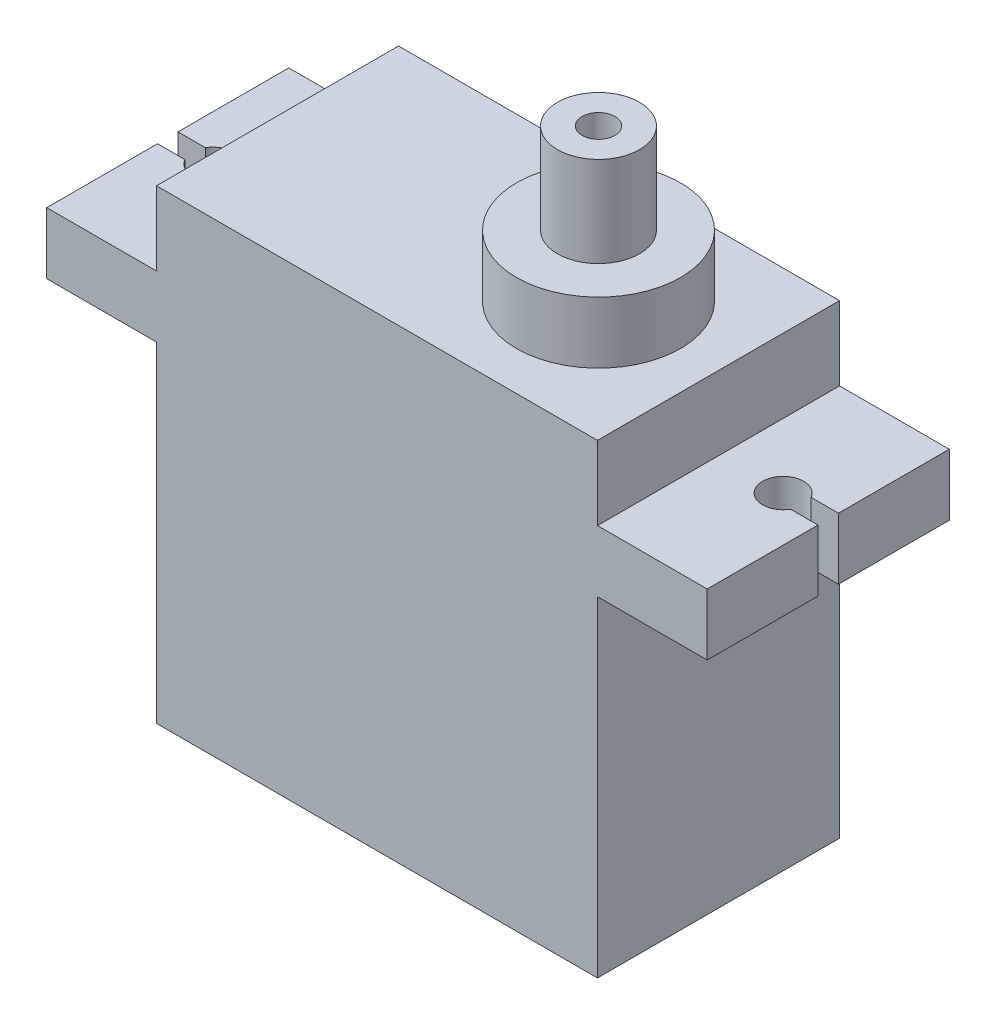
ISO-10303-21;
HEADER;
FILE_DESCRIPTION(('STEP AP214'),'2;1');
FILE_NAME('part.step','',(''),(''),'','','');
FILE_SCHEMA(('AUTOMOTIVE_DESIGN { 1 0 10303 214 1 1 1 1 }'));
ENDSEC;
DATA;
#1=APPLICATION_CONTEXT('core data for automotive mechanical design processes');
#2=APPLICATION_PROTOCOL_DEFINITION('international standard','automotive_design',2000,#1);
#3=PRODUCT_CONTEXT('',#1,'mechanical');
#4=PRODUCT('Part','Part','',(#3));
#5=PRODUCT_RELATED_PRODUCT_CATEGORY('part','',(#4));
#6=PRODUCT_DEFINITION_FORMATION('','',#4);
#7=PRODUCT_DEFINITION_CONTEXT('part definition',#1,'design');
#8=PRODUCT_DEFINITION('design','',#6,#7);
#9=PRODUCT_DEFINITION_SHAPE('','',#8);
#10=(LENGTH_UNIT() NAMED_UNIT(*) SI_UNIT(.MILLI.,.METRE.));
#11=(NAMED_UNIT(*) PLANE_ANGLE_UNIT() SI_UNIT($,.RADIAN.));
#12=(NAMED_UNIT(*) SI_UNIT($,.STERADIAN.) SOLID_ANGLE_UNIT());
#13=UNCERTAINTY_MEASURE_WITH_UNIT(LENGTH_MEASURE(1.E-05),#10,'distance_accuracy_value','');
#14=(GEOMETRIC_REPRESENTATION_CONTEXT(3) GLOBAL_UNCERTAINTY_ASSIGNED_CONTEXT((#13)) GLOBAL_UNIT_ASSIGNED_CONTEXT((#10,
#11,#12)) REPRESENTATION_CONTEXT('',''));
#15=CARTESIAN_POINT('',(0.,0.,0.));
#16=DIRECTION('',(0.,0.,1.));
#17=DIRECTION('',(1.,0.,0.));
#18=AXIS2_PLACEMENT_3D('',#15,#16,#17);
#19=CARTESIAN_POINT('',(21.5,22.7,0.));
#20=DIRECTION('',(-1.,0.,0.));
#21=DIRECTION('',(0.,0.,1.));
#22=AXIS2_PLACEMENT_3D('',#19,#20,#21);
#23=PLANE('',#22);
#24=DIRECTION('',(0.,0.,-1.));
#25=VECTOR('',#24,1.);
#26=CARTESIAN_POINT('',(21.5,16.1,0.));
#27=LINE('',#26,#25);
#28=CARTESIAN_POINT('',(21.5,16.1,11.8));
#29=VERTEX_POINT('',#28);
#30=CARTESIAN_POINT('',(21.5,16.1,0.));
#31=VERTEX_POINT('',#30);
#32=EDGE_CURVE('E316',#29,#31,#27,.T.);
#33=ORIENTED_EDGE('',*,*,#32,.F.);
#34=DIRECTION('',(0.,-1.,0.));
#35=VECTOR('',#34,1.);
#36=CARTESIAN_POINT('',(21.5,22.7,11.8));
#37=LINE('',#36,#35);
#38=CARTESIAN_POINT('',(21.5,0.,11.8));
#39=VERTEX_POINT('',#38);
#40=EDGE_CURVE('E287',#29,#39,#37,.T.);
#41=ORIENTED_EDGE('',*,*,#40,.T.);
#42=DIRECTION('',(0.,0.,-1.));
#43=VECTOR('',#42,1.);
#44=CARTESIAN_POINT('',(21.5,0.,0.));
#45=LINE('',#44,#43);
#46=CARTESIAN_POINT('',(21.5,0.,0.));
#47=VERTEX_POINT('',#46);
#48=EDGE_CURVE('E275',#39,#47,#45,.T.);
#49=ORIENTED_EDGE('',*,*,#48,.T.);
#50=DIRECTION('',(0.,-1.,0.));
#51=VECTOR('',#50,1.);
#52=CARTESIAN_POINT('',(21.5,22.7,0.));
#53=LINE('',#52,#51);
#54=EDGE_CURVE('E283',#31,#47,#53,.T.);
#55=ORIENTED_EDGE('',*,*,#54,.F.);
#56=EDGE_LOOP('',(#33,#41,#49,#55));
#57=FACE_BOUND('',#56,.T.);
#58=ADVANCED_FACE('F38',(#57),#23,.F.);
#59=CARTESIAN_POINT('',(0.,22.7,0.));
#60=DIRECTION('',(1.,0.,0.));
#61=DIRECTION('',(0.,0.,-1.));
#62=AXIS2_PLACEMENT_3D('',#59,#60,#61);
#63=PLANE('',#62);
#64=DIRECTION('',(0.,0.,1.));
#65=VECTOR('',#64,1.);
#66=CARTESIAN_POINT('',(0.,16.1,0.));
#67=LINE('',#66,#65);
#68=CARTESIAN_POINT('',(0.,16.1,0.));
#69=VERTEX_POINT('',#68);
#70=CARTESIAN_POINT('',(0.,16.1,11.8));
#71=VERTEX_POINT('',#70);
#72=EDGE_CURVE('E240',#69,#71,#67,.T.);
#73=ORIENTED_EDGE('',*,*,#72,.F.);
#74=DIRECTION('',(0.,-1.,0.));
#75=VECTOR('',#74,1.);
#76=CARTESIAN_POINT('',(0.,22.7,0.));
#77=LINE('',#76,#75);
#78=CARTESIAN_POINT('',(0.,0.,0.));
#79=VERTEX_POINT('',#78);
#80=EDGE_CURVE('E269',#69,#79,#77,.T.);
#81=ORIENTED_EDGE('',*,*,#80,.T.);
#82=DIRECTION('',(0.,0.,1.));
#83=VECTOR('',#82,1.);
#84=CARTESIAN_POINT('',(0.,0.,0.));
#85=LINE('',#84,#83);
#86=CARTESIAN_POINT('',(0.,0.,11.8));
#87=VERTEX_POINT('',#86);
#88=EDGE_CURVE('E258',#79,#87,#85,.T.);
#89=ORIENTED_EDGE('',*,*,#88,.T.);
#90=DIRECTION('',(0.,-1.,0.));
#91=VECTOR('',#90,1.);
#92=CARTESIAN_POINT('',(0.,22.7,11.8));
#93=LINE('',#92,#91);
#94=EDGE_CURVE('E290',#71,#87,#93,.T.);
#95=ORIENTED_EDGE('',*,*,#94,.F.);
#96=EDGE_LOOP('',(#73,#81,#89,#95));
#97=FACE_BOUND('',#96,.T.);
#98=ADVANCED_FACE('F305',(#97),#63,.F.);
#99=CARTESIAN_POINT('',(0.,22.7,0.));
#100=VERTEX_POINT('',#99);
#101=CARTESIAN_POINT('',(0.,19.1,0.));
#102=VERTEX_POINT('',#101);
#103=EDGE_CURVE('E280',#100,#102,#77,.T.);
#104=ORIENTED_EDGE('',*,*,#103,.T.);
#105=DIRECTION('',(0.,0.,1.));
#106=VECTOR('',#105,1.);
#107=CARTESIAN_POINT('',(0.,19.1,0.));
#108=LINE('',#107,#106);
#109=CARTESIAN_POINT('',(0.,19.1,11.8));
#110=VERTEX_POINT('',#109);
#111=EDGE_CURVE('E223',#102,#110,#108,.T.);
#112=ORIENTED_EDGE('',*,*,#111,.T.);
#113=CARTESIAN_POINT('',(0.,22.7,11.8));
#114=VERTEX_POINT('',#113);
#115=EDGE_CURVE('E46',#114,#110,#93,.T.);
#116=ORIENTED_EDGE('',*,*,#115,.F.);
#117=DIRECTION('',(0.,0.,1.));
#118=VECTOR('',#117,1.);
#119=CARTESIAN_POINT('',(0.,22.7,0.));
#120=LINE('',#119,#118);
#121=EDGE_CURVE('E259',#100,#114,#120,.T.);
#122=ORIENTED_EDGE('',*,*,#121,.F.);
#123=EDGE_LOOP('',(#104,#112,#116,#122));
#124=FACE_BOUND('',#123,.T.);
#125=ADVANCED_FACE('F40',(#124),#63,.F.);
#126=CARTESIAN_POINT('',(0.,22.7,11.8));
#127=DIRECTION('',(0.,0.,-1.));
#128=DIRECTION('',(-1.,0.,0.));
#129=AXIS2_PLACEMENT_3D('',#126,#127,#128);
#130=PLANE('',#129);
#131=DIRECTION('',(1.,0.,0.));
#132=VECTOR('',#131,1.);
#133=CARTESIAN_POINT('',(0.,0.,11.8));
#134=LINE('',#133,#132);
#135=EDGE_CURVE('E272',#87,#39,#134,.T.);
#136=ORIENTED_EDGE('',*,*,#135,.T.);
#137=ORIENTED_EDGE('',*,*,#40,.F.);
#138=DIRECTION('',(-1.,0.,0.));
#139=VECTOR('',#138,1.);
#140=CARTESIAN_POINT('',(0.,16.1,11.8));
#141=LINE('',#140,#139);
#142=CARTESIAN_POINT('',(26.85,16.1,11.8));
#143=VERTEX_POINT('',#142);
#144=EDGE_CURVE('E318',#143,#29,#141,.T.);
#145=ORIENTED_EDGE('',*,*,#144,.F.);
#146=DIRECTION('',(0.,-1.,0.));
#147=VECTOR('',#146,1.);
#148=CARTESIAN_POINT('',(26.85,19.1,11.8));
#149=LINE('',#148,#147);
#150=CARTESIAN_POINT('',(26.85,19.1,11.8));
#151=VERTEX_POINT('',#150);
#152=EDGE_CURVE('E321',#151,#143,#149,.T.);
#153=ORIENTED_EDGE('',*,*,#152,.F.);
#154=DIRECTION('',(-1.,0.,0.));
#155=VECTOR('',#154,1.);
#156=CARTESIAN_POINT('',(0.,19.1,11.8));
#157=LINE('',#156,#155);
#158=CARTESIAN_POINT('',(21.5,19.1,11.8));
#159=VERTEX_POINT('',#158);
#160=EDGE_CURVE('E341',#151,#159,#157,.T.);
#161=ORIENTED_EDGE('',*,*,#160,.T.);
#162=CARTESIAN_POINT('',(21.5,22.7,11.8));
#163=VERTEX_POINT('',#162);
#164=EDGE_CURVE('E288',#163,#159,#37,.T.);
#165=ORIENTED_EDGE('',*,*,#164,.F.);
#166=DIRECTION('',(1.,0.,0.));
#167=VECTOR('',#166,1.);
#168=CARTESIAN_POINT('',(0.,22.7,11.8));
#169=LINE('',#168,#167);
#170=EDGE_CURVE('E262',#114,#163,#169,.T.);
#171=ORIENTED_EDGE('',*,*,#170,.F.);
#172=ORIENTED_EDGE('',*,*,#115,.T.);
#173=DIRECTION('',(-1.,0.,0.));
#174=VECTOR('',#173,1.);
#175=CARTESIAN_POINT('',(0.,19.1,11.8));
#176=LINE('',#175,#174);
#177=CARTESIAN_POINT('',(-5.35,19.1,11.8));
#178=VERTEX_POINT('',#177);
#179=EDGE_CURVE('E61',#110,#178,#176,.T.);
#180=ORIENTED_EDGE('',*,*,#179,.T.);
#181=DIRECTION('',(0.,-1.,0.));
#182=VECTOR('',#181,1.);
#183=CARTESIAN_POINT('',(-5.35,19.1,11.8));
#184=LINE('',#183,#182);
#185=CARTESIAN_POINT('',(-5.35,16.1,11.8));
#186=VERTEX_POINT('',#185);
#187=EDGE_CURVE('E252',#178,#186,#184,.T.);
#188=ORIENTED_EDGE('',*,*,#187,.T.);
#189=DIRECTION('',(-1.,0.,0.));
#190=VECTOR('',#189,1.);
#191=CARTESIAN_POINT('',(0.,16.1,11.8));
#192=LINE('',#191,#190);
#193=EDGE_CURVE('E236',#71,#186,#192,.T.);
#194=ORIENTED_EDGE('',*,*,#193,.F.);
#195=ORIENTED_EDGE('',*,*,#94,.T.);
#196=EDGE_LOOP('',(#136,#137,#145,#153,#161,#165,#171,#172,#180,#188,#194,#195));
#197=FACE_BOUND('',#196,.T.);
#198=ADVANCED_FACE('F296',(#197),#130,.F.);
#199=ORIENTED_EDGE('',*,*,#164,.T.);
#200=DIRECTION('',(0.,0.,-1.));
#201=VECTOR('',#200,1.);
#202=CARTESIAN_POINT('',(21.5,19.1,0.));
#203=LINE('',#202,#201);
#204=CARTESIAN_POINT('',(21.5,19.1,0.));
#205=VERTEX_POINT('',#204);
#206=EDGE_CURVE('E343',#159,#205,#203,.T.);
#207=ORIENTED_EDGE('',*,*,#206,.T.);
#208=CARTESIAN_POINT('',(21.5,22.7,0.));
#209=VERTEX_POINT('',#208);
#210=EDGE_CURVE('E284',#209,#205,#53,.T.);
#211=ORIENTED_EDGE('',*,*,#210,.F.);
#212=DIRECTION('',(0.,0.,-1.));
#213=VECTOR('',#212,1.);
#214=CARTESIAN_POINT('',(21.5,22.7,0.));
#215=LINE('',#214,#213);
#216=EDGE_CURVE('E265',#163,#209,#215,.T.);
#217=ORIENTED_EDGE('',*,*,#216,.F.);
#218=EDGE_LOOP('',(#199,#207,#211,#217));
#219=FACE_BOUND('',#218,.T.);
#220=ADVANCED_FACE('F419',(#219),#23,.F.);
#221=CARTESIAN_POINT('',(0.,22.7,0.));
#222=DIRECTION('',(0.,0.,1.));
#223=DIRECTION('',(1.,0.,0.));
#224=AXIS2_PLACEMENT_3D('',#221,#222,#223);
#225=PLANE('',#224);
#226=DIRECTION('',(-1.,0.,0.));
#227=VECTOR('',#226,1.);
#228=CARTESIAN_POINT('',(0.,0.,0.));
#229=LINE('',#228,#227);
#230=EDGE_CURVE('E263',#47,#79,#229,.T.);
#231=ORIENTED_EDGE('',*,*,#230,.T.);
#232=ORIENTED_EDGE('',*,*,#80,.F.);
#233=DIRECTION('',(1.,0.,0.));
#234=VECTOR('',#233,1.);
#235=CARTESIAN_POINT('',(0.,16.1,0.));
#236=LINE('',#235,#234);
#237=CARTESIAN_POINT('',(-5.35,16.1,0.));
#238=VERTEX_POINT('',#237);
#239=EDGE_CURVE('E243',#238,#69,#236,.T.);
#240=ORIENTED_EDGE('',*,*,#239,.F.);
#241=DIRECTION('',(0.,-1.,0.));
#242=VECTOR('',#241,1.);
#243=CARTESIAN_POINT('',(-5.35,19.1,0.));
#244=LINE('',#243,#242);
#245=CARTESIAN_POINT('',(-5.35,19.1,0.));
#246=VERTEX_POINT('',#245);
#247=EDGE_CURVE('E250',#246,#238,#244,.T.);
#248=ORIENTED_EDGE('',*,*,#247,.F.);
#249=DIRECTION('',(1.,0.,0.));
#250=VECTOR('',#249,1.);
#251=CARTESIAN_POINT('',(0.,19.1,0.));
#252=LINE('',#251,#250);
#253=EDGE_CURVE('E225',#246,#102,#252,.T.);
#254=ORIENTED_EDGE('',*,*,#253,.T.);
#255=ORIENTED_EDGE('',*,*,#103,.F.);
#256=DIRECTION('',(-1.,0.,0.));
#257=VECTOR('',#256,1.);
#258=CARTESIAN_POINT('',(0.,22.7,0.));
#259=LINE('',#258,#257);
#260=EDGE_CURVE('E267',#209,#100,#259,.T.);
#261=ORIENTED_EDGE('',*,*,#260,.F.);
#262=ORIENTED_EDGE('',*,*,#210,.T.);
#263=DIRECTION('',(1.,0.,0.));
#264=VECTOR('',#263,1.);
#265=CARTESIAN_POINT('',(0.,19.1,0.));
#266=LINE('',#265,#264);
#267=CARTESIAN_POINT('',(26.85,19.1,0.));
#268=VERTEX_POINT('',#267);
#269=EDGE_CURVE('E53',#205,#268,#266,.T.);
#270=ORIENTED_EDGE('',*,*,#269,.T.);
#271=DIRECTION('',(0.,-1.,0.));
#272=VECTOR('',#271,1.);
#273=CARTESIAN_POINT('',(26.85,19.1,0.));
#274=LINE('',#273,#272);
#275=CARTESIAN_POINT('',(26.85,16.1,0.));
#276=VERTEX_POINT('',#275);
#277=EDGE_CURVE('E435',#268,#276,#274,.T.);
#278=ORIENTED_EDGE('',*,*,#277,.T.);
#279=DIRECTION('',(1.,0.,0.));
#280=VECTOR('',#279,1.);
#281=CARTESIAN_POINT('',(0.,16.1,0.));
#282=LINE('',#281,#280);
#283=EDGE_CURVE('E312',#31,#276,#282,.T.);
#284=ORIENTED_EDGE('',*,*,#283,.F.);
#285=ORIENTED_EDGE('',*,*,#54,.T.);
#286=EDGE_LOOP('',(#231,#232,#240,#248,#254,#255,#261,#262,#270,#278,#284,#285));
#287=FACE_BOUND('',#286,.T.);
#288=ADVANCED_FACE('F309',(#287),#225,.F.);
#289=CARTESIAN_POINT('',(0.,22.7,0.));
#290=DIRECTION('',(0.,1.,0.));
#291=DIRECTION('',(0.,0.,1.));
#292=AXIS2_PLACEMENT_3D('',#289,#290,#291);
#293=PLANE('',#292);
#294=CARTESIAN_POINT('',(15.65,22.7,5.9));
#295=DIRECTION('',(0.,1.,0.));
#296=DIRECTION('',(0.,0.,1.));
#297=AXIS2_PLACEMENT_3D('',#294,#295,#296);
#298=CIRCLE('',#297,4.);
#299=CARTESIAN_POINT('',(15.65,22.7,9.9));
#300=VERTEX_POINT('',#299);
#301=EDGE_CURVE('E359',#300,#300,#298,.T.);
#302=ORIENTED_EDGE('',*,*,#301,.F.);
#303=EDGE_LOOP('',(#302));
#304=FACE_BOUND('',#303,.T.);
#305=ORIENTED_EDGE('',*,*,#121,.T.);
#306=ORIENTED_EDGE('',*,*,#170,.T.);
#307=ORIENTED_EDGE('',*,*,#216,.T.);
#308=ORIENTED_EDGE('',*,*,#260,.T.);
#309=EDGE_LOOP('',(#305,#306,#307,#308));
#310=FACE_BOUND('',#309,.T.);
#311=ADVANCED_FACE('F373',(#304,#310),#293,.T.);
#312=CARTESIAN_POINT('',(0.,0.,0.));
#313=DIRECTION('',(0.,1.,0.));
#314=DIRECTION('',(0.,0.,1.));
#315=AXIS2_PLACEMENT_3D('',#312,#313,#314);
#316=PLANE('',#315);
#317=ORIENTED_EDGE('',*,*,#88,.F.);
#318=ORIENTED_EDGE('',*,*,#230,.F.);
#319=ORIENTED_EDGE('',*,*,#48,.F.);
#320=ORIENTED_EDGE('',*,*,#135,.F.);
#321=EDGE_LOOP('',(#317,#318,#319,#320));
#322=FACE_BOUND('',#321,.T.);
#323=ADVANCED_FACE('F303',(#322),#316,.F.);
#324=CARTESIAN_POINT('',(-3.15,19.1,5.9));
#325=DIRECTION('',(0.,-1.,0.));
#326=DIRECTION('',(0.,0.,-1.));
#327=AXIS2_PLACEMENT_3D('',#324,#325,#326);
#328=CYLINDRICAL_SURFACE('',#327,1.);
#329=CARTESIAN_POINT('',(-3.15,16.1,5.9));
#330=DIRECTION('',(0.,1.,0.));
#331=DIRECTION('',(0.,0.,1.));
#332=AXIS2_PLACEMENT_3D('',#329,#330,#331);
#333=CIRCLE('',#332,1.);
#334=CARTESIAN_POINT('',(-4.01602540378444,16.1,6.4));
#335=VERTEX_POINT('',#334);
#336=CARTESIAN_POINT('',(-4.01602540378444,16.1,5.4));
#337=VERTEX_POINT('',#336);
#338=EDGE_CURVE('E202',#335,#337,#333,.T.);
#339=ORIENTED_EDGE('',*,*,#338,.F.);
#340=DIRECTION('',(0.,-1.,0.));
#341=VECTOR('',#340,1.);
#342=CARTESIAN_POINT('',(-4.01602540378444,19.1,6.4));
#343=LINE('',#342,#341);
#344=CARTESIAN_POINT('',(-4.01602540378444,19.1,6.4));
#345=VERTEX_POINT('',#344);
#346=EDGE_CURVE('E256',#345,#335,#343,.T.);
#347=ORIENTED_EDGE('',*,*,#346,.F.);
#348=CARTESIAN_POINT('',(-3.15,19.1,5.9));
#349=DIRECTION('',(0.,1.,0.));
#350=DIRECTION('',(0.,0.,1.));
#351=AXIS2_PLACEMENT_3D('',#348,#349,#350);
#352=CIRCLE('',#351,1.);
#353=CARTESIAN_POINT('',(-4.01602540378444,19.1,5.4));
#354=VERTEX_POINT('',#353);
#355=EDGE_CURVE('E211',#345,#354,#352,.T.);
#356=ORIENTED_EDGE('',*,*,#355,.T.);
#357=DIRECTION('',(0.,-1.,0.));
#358=VECTOR('',#357,1.);
#359=CARTESIAN_POINT('',(-4.01602540378444,19.1,5.4));
#360=LINE('',#359,#358);
#361=EDGE_CURVE('E229',#354,#337,#360,.T.);
#362=ORIENTED_EDGE('',*,*,#361,.T.);
#363=EDGE_LOOP('',(#339,#347,#356,#362));
#364=FACE_BOUND('',#363,.T.);
#365=ADVANCED_FACE('F399',(#364),#328,.F.);
#366=CARTESIAN_POINT('',(0.,19.1,6.4));
#367=DIRECTION('',(0.,0.,-1.));
#368=DIRECTION('',(-1.,0.,0.));
#369=AXIS2_PLACEMENT_3D('',#366,#367,#368);
#370=PLANE('',#369);
#371=DIRECTION('',(1.,0.,0.));
#372=VECTOR('',#371,1.);
#373=CARTESIAN_POINT('',(0.,16.1,6.4));
#374=LINE('',#373,#372);
#375=CARTESIAN_POINT('',(-5.35,16.1,6.4));
#376=VERTEX_POINT('',#375);
#377=EDGE_CURVE('E205',#376,#335,#374,.T.);
#378=ORIENTED_EDGE('',*,*,#377,.F.);
#379=DIRECTION('',(0.,-1.,0.));
#380=VECTOR('',#379,1.);
#381=CARTESIAN_POINT('',(-5.35,19.1,6.4));
#382=LINE('',#381,#380);
#383=CARTESIAN_POINT('',(-5.35,19.1,6.4));
#384=VERTEX_POINT('',#383);
#385=EDGE_CURVE('E254',#384,#376,#382,.T.);
#386=ORIENTED_EDGE('',*,*,#385,.F.);
#387=DIRECTION('',(1.,0.,0.));
#388=VECTOR('',#387,1.);
#389=CARTESIAN_POINT('',(0.,19.1,6.4));
#390=LINE('',#389,#388);
#391=EDGE_CURVE('E214',#384,#345,#390,.T.);
#392=ORIENTED_EDGE('',*,*,#391,.T.);
#393=ORIENTED_EDGE('',*,*,#346,.T.);
#394=EDGE_LOOP('',(#378,#386,#392,#393));
#395=FACE_BOUND('',#394,.T.);
#396=ADVANCED_FACE('F402',(#395),#370,.T.);
#397=CARTESIAN_POINT('',(-5.35,19.1,0.));
#398=DIRECTION('',(-1.,0.,0.));
#399=DIRECTION('',(0.,0.,1.));
#400=AXIS2_PLACEMENT_3D('',#397,#398,#399);
#401=PLANE('',#400);
#402=DIRECTION('',(0.,0.,-1.));
#403=VECTOR('',#402,1.);
#404=CARTESIAN_POINT('',(-5.35,16.1,0.));
#405=LINE('',#404,#403);
#406=EDGE_CURVE('E233',#186,#376,#405,.T.);
#407=ORIENTED_EDGE('',*,*,#406,.F.);
#408=ORIENTED_EDGE('',*,*,#187,.F.);
#409=DIRECTION('',(0.,0.,-1.));
#410=VECTOR('',#409,1.);
#411=CARTESIAN_POINT('',(-5.35,19.1,0.));
#412=LINE('',#411,#410);
#413=EDGE_CURVE('E218',#178,#384,#412,.T.);
#414=ORIENTED_EDGE('',*,*,#413,.T.);
#415=ORIENTED_EDGE('',*,*,#385,.T.);
#416=EDGE_LOOP('',(#407,#408,#414,#415));
#417=FACE_BOUND('',#416,.T.);
#418=ADVANCED_FACE('F405',(#417),#401,.T.);
#419=CARTESIAN_POINT('',(-5.35,16.1,5.4));
#420=VERTEX_POINT('',#419);
#421=EDGE_CURVE('E237',#420,#238,#405,.T.);
#422=ORIENTED_EDGE('',*,*,#421,.F.);
#423=DIRECTION('',(0.,-1.,0.));
#424=VECTOR('',#423,1.);
#425=CARTESIAN_POINT('',(-5.35,19.1,5.4));
#426=LINE('',#425,#424);
#427=CARTESIAN_POINT('',(-5.35,19.1,5.4));
#428=VERTEX_POINT('',#427);
#429=EDGE_CURVE('E248',#428,#420,#426,.T.);
#430=ORIENTED_EDGE('',*,*,#429,.F.);
#431=EDGE_CURVE('E221',#428,#246,#412,.T.);
#432=ORIENTED_EDGE('',*,*,#431,.T.);
#433=ORIENTED_EDGE('',*,*,#247,.T.);
#434=EDGE_LOOP('',(#422,#430,#432,#433));
#435=FACE_BOUND('',#434,.T.);
#436=ADVANCED_FACE('F390',(#435),#401,.T.);
#437=CARTESIAN_POINT('',(0.,19.1,5.4));
#438=DIRECTION('',(0.,0.,-1.));
#439=DIRECTION('',(-1.,0.,0.));
#440=AXIS2_PLACEMENT_3D('',#437,#438,#439);
#441=PLANE('',#440);
#442=DIRECTION('',(1.,0.,0.));
#443=VECTOR('',#442,1.);
#444=CARTESIAN_POINT('',(0.,16.1,5.4));
#445=LINE('',#444,#443);
#446=EDGE_CURVE('E215',#420,#337,#445,.T.);
#447=ORIENTED_EDGE('',*,*,#446,.T.);
#448=ORIENTED_EDGE('',*,*,#361,.F.);
#449=DIRECTION('',(1.,0.,0.));
#450=VECTOR('',#449,1.);
#451=CARTESIAN_POINT('',(0.,19.1,5.4));
#452=LINE('',#451,#450);
#453=EDGE_CURVE('E228',#428,#354,#452,.T.);
#454=ORIENTED_EDGE('',*,*,#453,.F.);
#455=ORIENTED_EDGE('',*,*,#429,.T.);
#456=EDGE_LOOP('',(#447,#448,#454,#455));
#457=FACE_BOUND('',#456,.T.);
#458=ADVANCED_FACE('F395',(#457),#441,.F.);
#459=CARTESIAN_POINT('',(0.,19.1,0.));
#460=DIRECTION('',(0.,1.,0.));
#461=DIRECTION('',(0.,0.,1.));
#462=AXIS2_PLACEMENT_3D('',#459,#460,#461);
#463=PLANE('',#462);
#464=ORIENTED_EDGE('',*,*,#355,.F.);
#465=ORIENTED_EDGE('',*,*,#391,.F.);
#466=ORIENTED_EDGE('',*,*,#413,.F.);
#467=ORIENTED_EDGE('',*,*,#179,.F.);
#468=ORIENTED_EDGE('',*,*,#111,.F.);
#469=ORIENTED_EDGE('',*,*,#253,.F.);
#470=ORIENTED_EDGE('',*,*,#431,.F.);
#471=ORIENTED_EDGE('',*,*,#453,.T.);
#472=EDGE_LOOP('',(#464,#465,#466,#467,#468,#469,#470,#471));
#473=FACE_BOUND('',#472,.T.);
#474=ADVANCED_FACE('F384',(#473),#463,.T.);
#475=CARTESIAN_POINT('',(0.,16.1,0.));
#476=DIRECTION('',(0.,1.,0.));
#477=DIRECTION('',(0.,0.,1.));
#478=AXIS2_PLACEMENT_3D('',#475,#476,#477);
#479=PLANE('',#478);
#480=ORIENTED_EDGE('',*,*,#338,.T.);
#481=ORIENTED_EDGE('',*,*,#446,.F.);
#482=ORIENTED_EDGE('',*,*,#421,.T.);
#483=ORIENTED_EDGE('',*,*,#239,.T.);
#484=ORIENTED_EDGE('',*,*,#72,.T.);
#485=ORIENTED_EDGE('',*,*,#193,.T.);
#486=ORIENTED_EDGE('',*,*,#406,.T.);
#487=ORIENTED_EDGE('',*,*,#377,.T.);
#488=EDGE_LOOP('',(#480,#481,#482,#483,#484,#485,#486,#487));
#489=FACE_BOUND('',#488,.T.);
#490=ADVANCED_FACE('F407',(#489),#479,.F.);
#491=CARTESIAN_POINT('',(0.,19.1,6.40000000000001));
#492=DIRECTION('',(0.,0.,1.));
#493=DIRECTION('',(1.,0.,0.));
#494=AXIS2_PLACEMENT_3D('',#491,#492,#493);
#495=PLANE('',#494);
#496=DIRECTION('',(-1.,0.,0.));
#497=VECTOR('',#496,1.);
#498=CARTESIAN_POINT('',(0.,16.1,6.40000000000001));
#499=LINE('',#498,#497);
#500=CARTESIAN_POINT('',(26.85,16.1,6.4));
#501=VERTEX_POINT('',#500);
#502=CARTESIAN_POINT('',(25.5160254037844,16.1,6.4));
#503=VERTEX_POINT('',#502);
#504=EDGE_CURVE('E201',#501,#503,#499,.T.);
#505=ORIENTED_EDGE('',*,*,#504,.T.);
#506=DIRECTION('',(0.,-1.,0.));
#507=VECTOR('',#506,1.);
#508=CARTESIAN_POINT('',(25.5160254037844,19.1,6.4));
#509=LINE('',#508,#507);
#510=CARTESIAN_POINT('',(25.5160254037844,19.1,6.4));
#511=VERTEX_POINT('',#510);
#512=EDGE_CURVE('E182',#511,#503,#509,.T.);
#513=ORIENTED_EDGE('',*,*,#512,.F.);
#514=DIRECTION('',(-1.,0.,0.));
#515=VECTOR('',#514,1.);
#516=CARTESIAN_POINT('',(0.,19.1,6.40000000000001));
#517=LINE('',#516,#515);
#518=CARTESIAN_POINT('',(26.85,19.1,6.4));
#519=VERTEX_POINT('',#518);
#520=EDGE_CURVE('E188',#519,#511,#517,.T.);
#521=ORIENTED_EDGE('',*,*,#520,.F.);
#522=DIRECTION('',(0.,-1.,0.));
#523=VECTOR('',#522,1.);
#524=CARTESIAN_POINT('',(26.85,19.1,6.4));
#525=LINE('',#524,#523);
#526=EDGE_CURVE('E433',#519,#501,#525,.T.);
#527=ORIENTED_EDGE('',*,*,#526,.T.);
#528=EDGE_LOOP('',(#505,#513,#521,#527));
#529=FACE_BOUND('',#528,.T.);
#530=ADVANCED_FACE('F199',(#529),#495,.F.);
#531=CARTESIAN_POINT('',(24.65,19.1,5.9));
#532=DIRECTION('',(0.,-1.,0.));
#533=DIRECTION('',(0.,0.,-1.));
#534=AXIS2_PLACEMENT_3D('',#531,#532,#533);
#535=CYLINDRICAL_SURFACE('',#534,1.);
#536=CARTESIAN_POINT('',(24.65,16.1,5.9));
#537=DIRECTION('',(0.,1.,0.));
#538=DIRECTION('',(0.,0.,1.));
#539=AXIS2_PLACEMENT_3D('',#536,#537,#538);
#540=CIRCLE('',#539,1.);
#541=CARTESIAN_POINT('',(25.5160254037844,16.1,5.4));
#542=VERTEX_POINT('',#541);
#543=EDGE_CURVE('E335',#503,#542,#540,.F.);
#544=ORIENTED_EDGE('',*,*,#543,.T.);
#545=DIRECTION('',(0.,-1.,0.));
#546=VECTOR('',#545,1.);
#547=CARTESIAN_POINT('',(25.5160254037844,19.1,5.4));
#548=LINE('',#547,#546);
#549=CARTESIAN_POINT('',(25.5160254037844,19.1,5.4));
#550=VERTEX_POINT('',#549);
#551=EDGE_CURVE('E184',#550,#542,#548,.T.);
#552=ORIENTED_EDGE('',*,*,#551,.F.);
#553=CARTESIAN_POINT('',(24.65,19.1,5.9));
#554=DIRECTION('',(0.,1.,0.));
#555=DIRECTION('',(0.,0.,1.));
#556=AXIS2_PLACEMENT_3D('',#553,#554,#555);
#557=CIRCLE('',#556,1.);
#558=EDGE_CURVE('E177',#511,#550,#557,.F.);
#559=ORIENTED_EDGE('',*,*,#558,.F.);
#560=ORIENTED_EDGE('',*,*,#512,.T.);
#561=EDGE_LOOP('',(#544,#552,#559,#560));
#562=FACE_BOUND('',#561,.T.);
#563=ADVANCED_FACE('F180',(#562),#535,.F.);
#564=CARTESIAN_POINT('',(0.,19.1,5.39999999999999));
#565=DIRECTION('',(0.,0.,1.));
#566=DIRECTION('',(1.,0.,0.));
#567=AXIS2_PLACEMENT_3D('',#564,#565,#566);
#568=PLANE('',#567);
#569=DIRECTION('',(-1.,0.,0.));
#570=VECTOR('',#569,1.);
#571=CARTESIAN_POINT('',(0.,16.1,5.39999999999999));
#572=LINE('',#571,#570);
#573=CARTESIAN_POINT('',(26.85,16.1,5.4));
#574=VERTEX_POINT('',#573);
#575=EDGE_CURVE('E332',#574,#542,#572,.T.);
#576=ORIENTED_EDGE('',*,*,#575,.F.);
#577=DIRECTION('',(0.,-1.,0.));
#578=VECTOR('',#577,1.);
#579=CARTESIAN_POINT('',(26.85,19.1,5.4));
#580=LINE('',#579,#578);
#581=CARTESIAN_POINT('',(26.85,19.1,5.4));
#582=VERTEX_POINT('',#581);
#583=EDGE_CURVE('E207',#582,#574,#580,.T.);
#584=ORIENTED_EDGE('',*,*,#583,.F.);
#585=DIRECTION('',(-1.,0.,0.));
#586=VECTOR('',#585,1.);
#587=CARTESIAN_POINT('',(0.,19.1,5.39999999999999));
#588=LINE('',#587,#586);
#589=EDGE_CURVE('E187',#582,#550,#588,.T.);
#590=ORIENTED_EDGE('',*,*,#589,.T.);
#591=ORIENTED_EDGE('',*,*,#551,.T.);
#592=EDGE_LOOP('',(#576,#584,#590,#591));
#593=FACE_BOUND('',#592,.T.);
#594=ADVANCED_FACE('F442',(#593),#568,.T.);
#595=CARTESIAN_POINT('',(26.85,19.1,0.));
#596=DIRECTION('',(1.,0.,0.));
#597=DIRECTION('',(0.,0.,-1.));
#598=AXIS2_PLACEMENT_3D('',#595,#596,#597);
#599=PLANE('',#598);
#600=DIRECTION('',(0.,0.,1.));
#601=VECTOR('',#600,1.);
#602=CARTESIAN_POINT('',(26.85,16.1,0.));
#603=LINE('',#602,#601);
#604=EDGE_CURVE('E328',#276,#574,#603,.T.);
#605=ORIENTED_EDGE('',*,*,#604,.F.);
#606=ORIENTED_EDGE('',*,*,#277,.F.);
#607=DIRECTION('',(0.,0.,1.));
#608=VECTOR('',#607,1.);
#609=CARTESIAN_POINT('',(26.85,19.1,0.));
#610=LINE('',#609,#608);
#611=EDGE_CURVE('E346',#268,#582,#610,.T.);
#612=ORIENTED_EDGE('',*,*,#611,.T.);
#613=ORIENTED_EDGE('',*,*,#583,.T.);
#614=EDGE_LOOP('',(#605,#606,#612,#613));
#615=FACE_BOUND('',#614,.T.);
#616=ADVANCED_FACE('F440',(#615),#599,.T.);
#617=EDGE_CURVE('E197',#501,#143,#603,.T.);
#618=ORIENTED_EDGE('',*,*,#617,.F.);
#619=ORIENTED_EDGE('',*,*,#526,.F.);
#620=EDGE_CURVE('E195',#519,#151,#610,.T.);
#621=ORIENTED_EDGE('',*,*,#620,.T.);
#622=ORIENTED_EDGE('',*,*,#152,.T.);
#623=EDGE_LOOP('',(#618,#619,#621,#622));
#624=FACE_BOUND('',#623,.T.);
#625=ADVANCED_FACE('F432',(#624),#599,.T.);
#626=CARTESIAN_POINT('',(0.,19.1,0.));
#627=DIRECTION('',(0.,1.,0.));
#628=DIRECTION('',(0.,0.,1.));
#629=AXIS2_PLACEMENT_3D('',#626,#627,#628);
#630=PLANE('',#629);
#631=ORIENTED_EDGE('',*,*,#520,.T.);
#632=ORIENTED_EDGE('',*,*,#558,.T.);
#633=ORIENTED_EDGE('',*,*,#589,.F.);
#634=ORIENTED_EDGE('',*,*,#611,.F.);
#635=ORIENTED_EDGE('',*,*,#269,.F.);
#636=ORIENTED_EDGE('',*,*,#206,.F.);
#637=ORIENTED_EDGE('',*,*,#160,.F.);
#638=ORIENTED_EDGE('',*,*,#620,.F.);
#639=EDGE_LOOP('',(#631,#632,#633,#634,#635,#636,#637,#638));
#640=FACE_BOUND('',#639,.T.);
#641=ADVANCED_FACE('F192',(#640),#630,.T.);
#642=CARTESIAN_POINT('',(0.,16.1,0.));
#643=DIRECTION('',(0.,1.,0.));
#644=DIRECTION('',(0.,0.,1.));
#645=AXIS2_PLACEMENT_3D('',#642,#643,#644);
#646=PLANE('',#645);
#647=ORIENTED_EDGE('',*,*,#504,.F.);
#648=ORIENTED_EDGE('',*,*,#617,.T.);
#649=ORIENTED_EDGE('',*,*,#144,.T.);
#650=ORIENTED_EDGE('',*,*,#32,.T.);
#651=ORIENTED_EDGE('',*,*,#283,.T.);
#652=ORIENTED_EDGE('',*,*,#604,.T.);
#653=ORIENTED_EDGE('',*,*,#575,.T.);
#654=ORIENTED_EDGE('',*,*,#543,.F.);
#655=EDGE_LOOP('',(#647,#648,#649,#650,#651,#652,#653,#654));
#656=FACE_BOUND('',#655,.T.);
#657=ADVANCED_FACE('F325',(#656),#646,.F.);
#658=CARTESIAN_POINT('',(15.65,25.7,5.9));
#659=DIRECTION('',(0.,-1.,0.));
#660=DIRECTION('',(0.,0.,-1.));
#661=AXIS2_PLACEMENT_3D('',#658,#659,#660);
#662=CYLINDRICAL_SURFACE('',#661,4.);
#663=CARTESIAN_POINT('',(15.65,25.7,5.9));
#664=DIRECTION('',(0.,1.,0.));
#665=DIRECTION('',(0.,0.,1.));
#666=AXIS2_PLACEMENT_3D('',#663,#664,#665);
#667=CIRCLE('',#666,4.);
#668=CARTESIAN_POINT('',(15.65,25.7,9.9));
#669=VERTEX_POINT('',#668);
#670=EDGE_CURVE('E358',#669,#669,#667,.T.);
#671=ORIENTED_EDGE('',*,*,#670,.F.);
#672=EDGE_LOOP('',(#671));
#673=FACE_BOUND('',#672,.T.);
#674=ORIENTED_EDGE('',*,*,#301,.T.);
#675=EDGE_LOOP('',(#674));
#676=FACE_BOUND('',#675,.T.);
#677=ADVANCED_FACE('F367',(#673,#676),#662,.T.);
#678=CARTESIAN_POINT('',(15.65,25.7,5.9));
#679=DIRECTION('',(0.,1.,0.));
#680=DIRECTION('',(0.,0.,1.));
#681=AXIS2_PLACEMENT_3D('',#678,#679,#680);
#682=PLANE('',#681);
#683=CARTESIAN_POINT('',(15.65,25.7,5.9));
#684=DIRECTION('',(0.,1.,0.));
#685=DIRECTION('',(0.,0.,1.));
#686=AXIS2_PLACEMENT_3D('',#683,#684,#685);
#687=CIRCLE('',#686,2.);
#688=CARTESIAN_POINT('',(15.65,25.7,7.9));
#689=VERTEX_POINT('',#688);
#690=EDGE_CURVE('E355',#689,#689,#687,.T.);
#691=ORIENTED_EDGE('',*,*,#690,.F.);
#692=EDGE_LOOP('',(#691));
#693=FACE_BOUND('',#692,.T.);
#694=ORIENTED_EDGE('',*,*,#670,.T.);
#695=EDGE_LOOP('',(#694));
#696=FACE_BOUND('',#695,.T.);
#697=ADVANCED_FACE('F365',(#693,#696),#682,.T.);
#698=CARTESIAN_POINT('',(15.65,30.1,5.9));
#699=DIRECTION('',(0.,-1.,0.));
#700=DIRECTION('',(0.,0.,-1.));
#701=AXIS2_PLACEMENT_3D('',#698,#699,#700);
#702=CYLINDRICAL_SURFACE('',#701,2.);
#703=ORIENTED_EDGE('',*,*,#690,.T.);
#704=EDGE_LOOP('',(#703));
#705=FACE_BOUND('',#704,.T.);
#706=CARTESIAN_POINT('',(15.65,30.1,5.9));
#707=DIRECTION('',(0.,1.,0.));
#708=DIRECTION('',(0.,0.,1.));
#709=AXIS2_PLACEMENT_3D('',#706,#707,#708);
#710=CIRCLE('',#709,2.);
#711=CARTESIAN_POINT('',(15.65,30.1,7.9));
#712=VERTEX_POINT('',#711);
#713=EDGE_CURVE('E340',#712,#712,#710,.T.);
#714=ORIENTED_EDGE('',*,*,#713,.F.);
#715=EDGE_LOOP('',(#714));
#716=FACE_BOUND('',#715,.T.);
#717=ADVANCED_FACE('F457',(#705,#716),#702,.T.);
#718=CARTESIAN_POINT('',(15.65,30.1,5.9));
#719=DIRECTION('',(0.,1.,0.));
#720=DIRECTION('',(0.,0.,1.));
#721=AXIS2_PLACEMENT_3D('',#718,#719,#720);
#722=PLANE('',#721);
#723=ORIENTED_EDGE('',*,*,#713,.T.);
#724=EDGE_LOOP('',(#723));
#725=FACE_BOUND('',#724,.T.);
#726=CARTESIAN_POINT('',(15.65,30.1,5.9));
#727=DIRECTION('',(0.,1.,0.));
#728=DIRECTION('',(0.,0.,1.));
#729=AXIS2_PLACEMENT_3D('',#726,#727,#728);
#730=CIRCLE('',#729,0.799999999999999);
#731=CARTESIAN_POINT('',(15.65,30.1,6.7));
#732=VERTEX_POINT('',#731);
#733=EDGE_CURVE('E352',#732,#732,#730,.T.);
#734=ORIENTED_EDGE('',*,*,#733,.F.);
#735=EDGE_LOOP('',(#734));
#736=FACE_BOUND('',#735,.T.);
#737=ADVANCED_FACE('F460',(#725,#736),#722,.T.);
#738=CARTESIAN_POINT('',(15.65,30.1,5.9));
#739=DIRECTION('',(0.,-1.,0.));
#740=DIRECTION('',(0.,0.,-1.));
#741=AXIS2_PLACEMENT_3D('',#738,#739,#740);
#742=CYLINDRICAL_SURFACE('',#741,0.799999999999999);
#743=CARTESIAN_POINT('',(15.65,25.7,5.9));
#744=DIRECTION('',(0.,1.,0.));
#745=DIRECTION('',(0.,0.,1.));
#746=AXIS2_PLACEMENT_3D('',#743,#744,#745);
#747=CIRCLE('',#746,0.799999999999999);
#748=CARTESIAN_POINT('',(15.65,25.7,6.7));
#749=VERTEX_POINT('',#748);
#750=EDGE_CURVE('E11',#749,#749,#747,.T.);
#751=ORIENTED_EDGE('',*,*,#750,.F.);
#752=EDGE_LOOP('',(#751));
#753=FACE_BOUND('',#752,.T.);
#754=ORIENTED_EDGE('',*,*,#733,.T.);
#755=EDGE_LOOP('',(#754));
#756=FACE_BOUND('',#755,.T.);
#757=ADVANCED_FACE('F464',(#753,#756),#742,.F.);
#758=ORIENTED_EDGE('',*,*,#750,.T.);
#759=EDGE_LOOP('',(#758));
#760=FACE_BOUND('',#759,.T.);
#761=ADVANCED_FACE('F467',(#760),#682,.T.);
#762=CLOSED_SHELL('',(#58,#98,#125,#198,#220,#288,#311,#323,#365,#396,#418,#436,#458,#474,#490,
#530,#563,#594,#616,#625,#641,#657,#677,#697,#717,#737,#757,#761));
#763=MANIFOLD_SOLID_BREP('B2',#762);
#764=ADVANCED_BREP_SHAPE_REPRESENTATION('',(#18,#763),#14);
#765=SHAPE_DEFINITION_REPRESENTATION(#9,#764);
ENDSEC;
END-ISO-10303-21;
